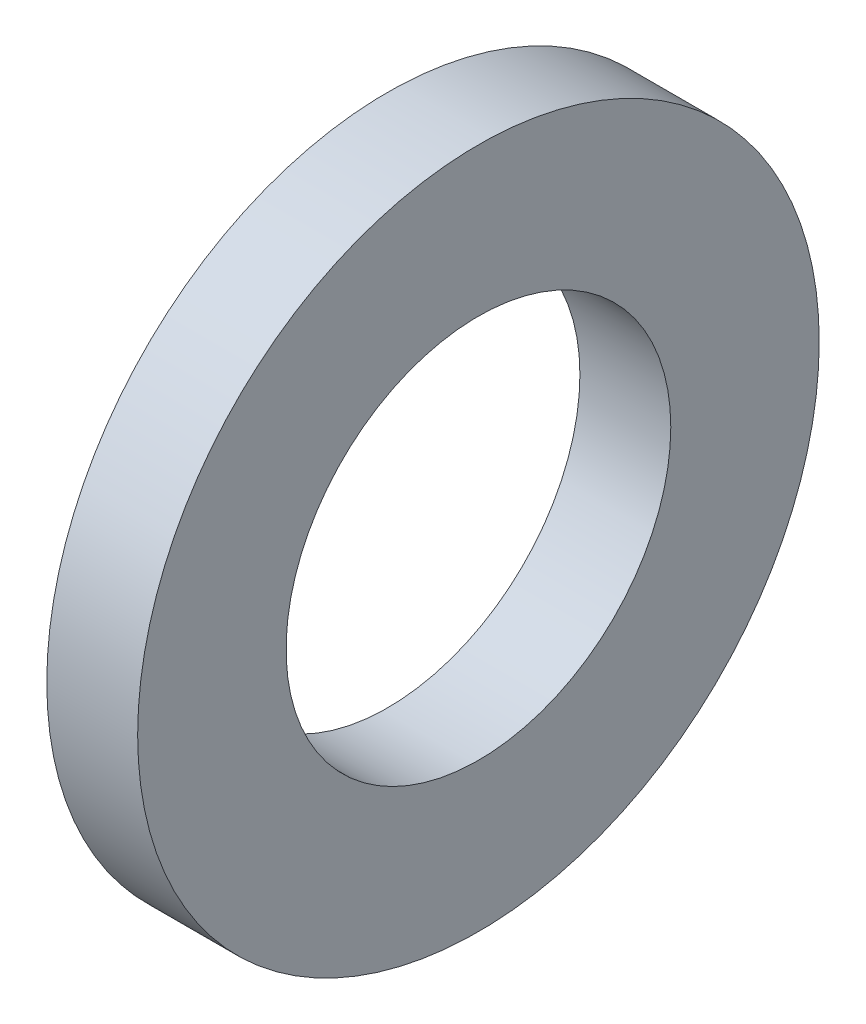
ISO-10303-21;
HEADER;
FILE_DESCRIPTION(('STEP AP214'),'2;1');
FILE_NAME('part.step','',(''),(''),'','','');
FILE_SCHEMA(('AUTOMOTIVE_DESIGN { 1 0 10303 214 1 1 1 1 }'));
ENDSEC;
DATA;
#1=APPLICATION_CONTEXT('core data for automotive mechanical design processes');
#2=APPLICATION_PROTOCOL_DEFINITION('international standard','automotive_design',2000,#1);
#3=PRODUCT_CONTEXT('',#1,'mechanical');
#4=PRODUCT('Part','Part','',(#3));
#5=PRODUCT_RELATED_PRODUCT_CATEGORY('part','',(#4));
#6=PRODUCT_DEFINITION_FORMATION('','',#4);
#7=PRODUCT_DEFINITION_CONTEXT('part definition',#1,'design');
#8=PRODUCT_DEFINITION('design','',#6,#7);
#9=PRODUCT_DEFINITION_SHAPE('','',#8);
#10=(LENGTH_UNIT() NAMED_UNIT(*) SI_UNIT(.MILLI.,.METRE.));
#11=(NAMED_UNIT(*) PLANE_ANGLE_UNIT() SI_UNIT($,.RADIAN.));
#12=(NAMED_UNIT(*) SI_UNIT($,.STERADIAN.) SOLID_ANGLE_UNIT());
#13=UNCERTAINTY_MEASURE_WITH_UNIT(LENGTH_MEASURE(1.E-05),#10,'distance_accuracy_value','');
#14=(GEOMETRIC_REPRESENTATION_CONTEXT(3) GLOBAL_UNCERTAINTY_ASSIGNED_CONTEXT((#13)) GLOBAL_UNIT_ASSIGNED_CONTEXT((#10,
#11,#12)) REPRESENTATION_CONTEXT('',''));
#15=CARTESIAN_POINT('',(0.,0.,0.));
#16=DIRECTION('',(0.,0.,1.));
#17=DIRECTION('',(1.,0.,0.));
#18=AXIS2_PLACEMENT_3D('',#15,#16,#17);
#19=CARTESIAN_POINT('',(0.,0.,0.));
#20=DIRECTION('',(1.,0.,0.));
#21=DIRECTION('',(0.,0.,1.));
#22=AXIS2_PLACEMENT_3D('',#19,#20,#21);
#23=PLANE('',#22);
#24=CARTESIAN_POINT('',(0.,0.,0.));
#25=DIRECTION('',(-1.,0.,0.));
#26=DIRECTION('',(0.,0.,1.));
#27=AXIS2_PLACEMENT_3D('',#24,#25,#26);
#28=CIRCLE('',#27,5.715);
#29=CARTESIAN_POINT('',(0.,0.,-5.715));
#30=VERTEX_POINT('',#29);
#31=EDGE_CURVE('E10',#30,#30,#28,.T.);
#32=ORIENTED_EDGE('',*,*,#31,.T.);
#33=EDGE_LOOP('',(#32));
#34=FACE_BOUND('',#33,.T.);
#35=CARTESIAN_POINT('',(0.,0.,0.));
#36=DIRECTION('',(-1.,0.,0.));
#37=DIRECTION('',(0.,0.,1.));
#38=AXIS2_PLACEMENT_3D('',#35,#36,#37);
#39=CIRCLE('',#38,3.2258);
#40=CARTESIAN_POINT('',(0.,0.,-3.2258));
#41=VERTEX_POINT('',#40);
#42=EDGE_CURVE('E48',#41,#41,#39,.T.);
#43=ORIENTED_EDGE('',*,*,#42,.F.);
#44=EDGE_LOOP('',(#43));
#45=FACE_BOUND('',#44,.T.);
#46=ADVANCED_FACE('F41',(#34,#45),#23,.F.);
#47=CARTESIAN_POINT('',(0.762,0.,0.));
#48=DIRECTION('',(-1.,0.,0.));
#49=DIRECTION('',(0.,0.,-1.));
#50=AXIS2_PLACEMENT_3D('',#47,#48,#49);
#51=CYLINDRICAL_SURFACE('',#50,5.715);
#52=CARTESIAN_POINT('',(1.524,0.,0.));
#53=DIRECTION('',(1.,0.,0.));
#54=DIRECTION('',(0.,0.,-1.));
#55=AXIS2_PLACEMENT_3D('',#52,#53,#54);
#56=CIRCLE('',#55,5.715);
#57=CARTESIAN_POINT('',(1.524,0.,-5.715));
#58=VERTEX_POINT('',#57);
#59=EDGE_CURVE('E52',#58,#58,#56,.T.);
#60=CARTESIAN_POINT('',(0.,0.,-5.715));
#61=CARTESIAN_POINT('',(0.015875,0.,-5.715));
#62=CARTESIAN_POINT('',(0.03175,0.,-5.715));
#63=CARTESIAN_POINT('',(0.0635,0.,-5.715));
#64=CARTESIAN_POINT('',(0.0793750000000001,0.,-5.715));
#65=CARTESIAN_POINT('',(0.111125,0.,-5.715));
#66=CARTESIAN_POINT('',(0.127,0.,-5.715));
#67=CARTESIAN_POINT('',(0.15875,0.,-5.715));
#68=CARTESIAN_POINT('',(0.174625,0.,-5.715));
#69=CARTESIAN_POINT('',(0.206375,0.,-5.715));
#70=CARTESIAN_POINT('',(0.22225,0.,-5.715));
#71=CARTESIAN_POINT('',(0.254,0.,-5.715));
#72=CARTESIAN_POINT('',(0.269875,0.,-5.715));
#73=CARTESIAN_POINT('',(0.301625,0.,-5.715));
#74=CARTESIAN_POINT('',(0.3175,0.,-5.715));
#75=CARTESIAN_POINT('',(0.34925,0.,-5.715));
#76=CARTESIAN_POINT('',(0.365125,0.,-5.715));
#77=CARTESIAN_POINT('',(0.396875,0.,-5.715));
#78=CARTESIAN_POINT('',(0.41275,0.,-5.715));
#79=CARTESIAN_POINT('',(0.4445,0.,-5.715));
#80=CARTESIAN_POINT('',(0.460375,0.,-5.715));
#81=CARTESIAN_POINT('',(0.492125,0.,-5.715));
#82=CARTESIAN_POINT('',(0.508,0.,-5.715));
#83=CARTESIAN_POINT('',(0.53975,0.,-5.715));
#84=CARTESIAN_POINT('',(0.555625,0.,-5.715));
#85=CARTESIAN_POINT('',(0.587375,0.,-5.715));
#86=CARTESIAN_POINT('',(0.60325,0.,-5.715));
#87=CARTESIAN_POINT('',(0.635,0.,-5.715));
#88=CARTESIAN_POINT('',(0.650875,0.,-5.715));
#89=CARTESIAN_POINT('',(0.682625,0.,-5.715));
#90=CARTESIAN_POINT('',(0.6985,0.,-5.715));
#91=CARTESIAN_POINT('',(0.73025,0.,-5.715));
#92=CARTESIAN_POINT('',(0.746125,0.,-5.715));
#93=CARTESIAN_POINT('',(0.777875,0.,-5.715));
#94=CARTESIAN_POINT('',(0.79375,0.,-5.715));
#95=CARTESIAN_POINT('',(0.8255,0.,-5.715));
#96=CARTESIAN_POINT('',(0.841375,0.,-5.715));
#97=CARTESIAN_POINT('',(0.873125,0.,-5.715));
#98=CARTESIAN_POINT('',(0.889,0.,-5.715));
#99=CARTESIAN_POINT('',(0.92075,0.,-5.715));
#100=CARTESIAN_POINT('',(0.936625,0.,-5.715));
#101=CARTESIAN_POINT('',(0.968375,0.,-5.715));
#102=CARTESIAN_POINT('',(0.98425,0.,-5.715));
#103=CARTESIAN_POINT('',(1.016,0.,-5.715));
#104=CARTESIAN_POINT('',(1.031875,0.,-5.715));
#105=CARTESIAN_POINT('',(1.063625,0.,-5.715));
#106=CARTESIAN_POINT('',(1.0795,0.,-5.715));
#107=CARTESIAN_POINT('',(1.11125,0.,-5.715));
#108=CARTESIAN_POINT('',(1.127125,0.,-5.715));
#109=CARTESIAN_POINT('',(1.158875,0.,-5.715));
#110=CARTESIAN_POINT('',(1.17475,0.,-5.715));
#111=CARTESIAN_POINT('',(1.2065,0.,-5.715));
#112=CARTESIAN_POINT('',(1.222375,0.,-5.715));
#113=CARTESIAN_POINT('',(1.254125,0.,-5.715));
#114=CARTESIAN_POINT('',(1.27,0.,-5.715));
#115=CARTESIAN_POINT('',(1.30175,0.,-5.715));
#116=CARTESIAN_POINT('',(1.317625,0.,-5.715));
#117=CARTESIAN_POINT('',(1.349375,0.,-5.715));
#118=CARTESIAN_POINT('',(1.36525,0.,-5.715));
#119=CARTESIAN_POINT('',(1.397,0.,-5.715));
#120=CARTESIAN_POINT('',(1.412875,0.,-5.715));
#121=CARTESIAN_POINT('',(1.444625,0.,-5.715));
#122=CARTESIAN_POINT('',(1.4605,0.,-5.715));
#123=CARTESIAN_POINT('',(1.49225,0.,-5.715));
#124=CARTESIAN_POINT('',(1.508125,0.,-5.715));
#125=CARTESIAN_POINT('',(1.524,0.,-5.715));
#126=B_SPLINE_CURVE_WITH_KNOTS('',3,(#60,#61,#62,#63,#64,#65,#66,#67,#68,#69,#70,#71,#72,#73,
#74,#75,#76,#77,#78,#79,#80,#81,#82,#83,#84,#85,#86,#87,#88,#89,#90,#91,#92,#93,#94,#95,#96,#97,
#98,#99,#100,#101,#102,#103,#104,#105,#106,#107,#108,#109,#110,#111,#112,#113,#114,#115,#116,
#117,#118,#119,#120,#121,#122,#123,#124,#125),.UNSPECIFIED.,.F.,.F.,(4,2,2,2,2,2,2,2,2,2,2,2,2,
2,2,2,2,2,2,2,2,2,2,2,2,2,2,2,2,2,2,2,4),(0.,0.047625,0.0952500000000001,0.142875,0.1905,
0.238125,0.28575,0.333375,0.381,0.428625,0.47625,0.523875,0.5715,0.619125,0.66675,0.714375,
0.762,0.809625,0.85725,0.904875,0.9525,1.000125,1.04775,1.095375,1.143,1.190625,1.23825,
1.285875,1.3335,1.381125,1.42875,1.476375,1.524),.UNSPECIFIED.);
#127=EDGE_CURVE('BSEAM43',#30,#58,#126,.T.);
#128=ORIENTED_EDGE('',*,*,#31,.F.);
#129=ORIENTED_EDGE('',*,*,#59,.F.);
#130=ORIENTED_EDGE('',*,*,#127,.T.);
#131=ORIENTED_EDGE('',*,*,#127,.F.);
#132=EDGE_LOOP('',(#128,#130,#129,#131));
#133=FACE_BOUND('',#132,.T.);
#134=ADVANCED_FACE('F43',(#133),#51,.T.);
#135=CARTESIAN_POINT('',(0.762,0.,0.));
#136=DIRECTION('',(-1.,0.,0.));
#137=DIRECTION('',(0.,0.,-1.));
#138=AXIS2_PLACEMENT_3D('',#135,#136,#137);
#139=CYLINDRICAL_SURFACE('',#138,3.2258);
#140=CARTESIAN_POINT('',(1.524,0.,0.));
#141=DIRECTION('',(1.,0.,0.));
#142=DIRECTION('',(0.,0.,-1.));
#143=AXIS2_PLACEMENT_3D('',#140,#141,#142);
#144=CIRCLE('',#143,3.2258);
#145=CARTESIAN_POINT('',(1.524,0.,-3.2258));
#146=VERTEX_POINT('',#145);
#147=EDGE_CURVE('E56',#146,#146,#144,.T.);
#148=CARTESIAN_POINT('',(0.,0.,-3.2258));
#149=CARTESIAN_POINT('',(0.015875,0.,-3.2258));
#150=CARTESIAN_POINT('',(0.03175,0.,-3.2258));
#151=CARTESIAN_POINT('',(0.0635,0.,-3.2258));
#152=CARTESIAN_POINT('',(0.0793750000000001,0.,-3.2258));
#153=CARTESIAN_POINT('',(0.111125,0.,-3.2258));
#154=CARTESIAN_POINT('',(0.127,0.,-3.2258));
#155=CARTESIAN_POINT('',(0.15875,0.,-3.2258));
#156=CARTESIAN_POINT('',(0.174625,0.,-3.2258));
#157=CARTESIAN_POINT('',(0.206375,0.,-3.2258));
#158=CARTESIAN_POINT('',(0.22225,0.,-3.2258));
#159=CARTESIAN_POINT('',(0.254,0.,-3.2258));
#160=CARTESIAN_POINT('',(0.269875,0.,-3.2258));
#161=CARTESIAN_POINT('',(0.301625,0.,-3.2258));
#162=CARTESIAN_POINT('',(0.3175,0.,-3.2258));
#163=CARTESIAN_POINT('',(0.34925,0.,-3.2258));
#164=CARTESIAN_POINT('',(0.365125,0.,-3.2258));
#165=CARTESIAN_POINT('',(0.396875,0.,-3.2258));
#166=CARTESIAN_POINT('',(0.41275,0.,-3.2258));
#167=CARTESIAN_POINT('',(0.4445,0.,-3.2258));
#168=CARTESIAN_POINT('',(0.460375,0.,-3.2258));
#169=CARTESIAN_POINT('',(0.492125,0.,-3.2258));
#170=CARTESIAN_POINT('',(0.508,0.,-3.2258));
#171=CARTESIAN_POINT('',(0.53975,0.,-3.2258));
#172=CARTESIAN_POINT('',(0.555625,0.,-3.2258));
#173=CARTESIAN_POINT('',(0.587375,0.,-3.2258));
#174=CARTESIAN_POINT('',(0.60325,0.,-3.2258));
#175=CARTESIAN_POINT('',(0.635,0.,-3.2258));
#176=CARTESIAN_POINT('',(0.650875,0.,-3.2258));
#177=CARTESIAN_POINT('',(0.682625,0.,-3.2258));
#178=CARTESIAN_POINT('',(0.6985,0.,-3.2258));
#179=CARTESIAN_POINT('',(0.73025,0.,-3.2258));
#180=CARTESIAN_POINT('',(0.746125,0.,-3.2258));
#181=CARTESIAN_POINT('',(0.777875,0.,-3.2258));
#182=CARTESIAN_POINT('',(0.79375,0.,-3.2258));
#183=CARTESIAN_POINT('',(0.8255,0.,-3.2258));
#184=CARTESIAN_POINT('',(0.841375,0.,-3.2258));
#185=CARTESIAN_POINT('',(0.873125,0.,-3.2258));
#186=CARTESIAN_POINT('',(0.889,0.,-3.2258));
#187=CARTESIAN_POINT('',(0.92075,0.,-3.2258));
#188=CARTESIAN_POINT('',(0.936625,0.,-3.2258));
#189=CARTESIAN_POINT('',(0.968375,0.,-3.2258));
#190=CARTESIAN_POINT('',(0.98425,0.,-3.2258));
#191=CARTESIAN_POINT('',(1.016,0.,-3.2258));
#192=CARTESIAN_POINT('',(1.031875,0.,-3.2258));
#193=CARTESIAN_POINT('',(1.063625,0.,-3.2258));
#194=CARTESIAN_POINT('',(1.0795,0.,-3.2258));
#195=CARTESIAN_POINT('',(1.11125,0.,-3.2258));
#196=CARTESIAN_POINT('',(1.127125,0.,-3.2258));
#197=CARTESIAN_POINT('',(1.158875,0.,-3.2258));
#198=CARTESIAN_POINT('',(1.17475,0.,-3.2258));
#199=CARTESIAN_POINT('',(1.2065,0.,-3.2258));
#200=CARTESIAN_POINT('',(1.222375,0.,-3.2258));
#201=CARTESIAN_POINT('',(1.254125,0.,-3.2258));
#202=CARTESIAN_POINT('',(1.27,0.,-3.2258));
#203=CARTESIAN_POINT('',(1.30175,0.,-3.2258));
#204=CARTESIAN_POINT('',(1.317625,0.,-3.2258));
#205=CARTESIAN_POINT('',(1.349375,0.,-3.2258));
#206=CARTESIAN_POINT('',(1.36525,0.,-3.2258));
#207=CARTESIAN_POINT('',(1.397,0.,-3.2258));
#208=CARTESIAN_POINT('',(1.412875,0.,-3.2258));
#209=CARTESIAN_POINT('',(1.444625,0.,-3.2258));
#210=CARTESIAN_POINT('',(1.4605,0.,-3.2258));
#211=CARTESIAN_POINT('',(1.49225,0.,-3.2258));
#212=CARTESIAN_POINT('',(1.508125,0.,-3.2258));
#213=CARTESIAN_POINT('',(1.524,0.,-3.2258));
#214=B_SPLINE_CURVE_WITH_KNOTS('',3,(#148,#149,#150,#151,#152,#153,#154,#155,#156,#157,#158,
#159,#160,#161,#162,#163,#164,#165,#166,#167,#168,#169,#170,#171,#172,#173,#174,#175,#176,#177,
#178,#179,#180,#181,#182,#183,#184,#185,#186,#187,#188,#189,#190,#191,#192,#193,#194,#195,#196,
#197,#198,#199,#200,#201,#202,#203,#204,#205,#206,#207,#208,#209,#210,#211,#212,#213),
.UNSPECIFIED.,.F.,.F.,(4,2,2,2,2,2,2,2,2,2,2,2,2,2,2,2,2,2,2,2,2,2,2,2,2,2,2,2,2,2,2,2,4),(0.,
0.047625,0.0952500000000001,0.142875,0.1905,0.238125,0.28575,0.333375,0.381,0.428625,0.47625,
0.523875,0.5715,0.619125,0.66675,0.714375,0.762,0.809625,0.85725,0.904875,0.9525,1.000125,
1.04775,1.095375,1.143,1.190625,1.23825,1.285875,1.3335,1.381125,1.42875,1.476375,1.524),.UNSPECIFIED.);
#215=EDGE_CURVE('BSEAM62',#41,#146,#214,.T.);
#216=ORIENTED_EDGE('',*,*,#42,.T.);
#217=ORIENTED_EDGE('',*,*,#147,.T.);
#218=ORIENTED_EDGE('',*,*,#215,.T.);
#219=ORIENTED_EDGE('',*,*,#215,.F.);
#220=EDGE_LOOP('',(#216,#218,#217,#219));
#221=FACE_BOUND('',#220,.T.);
#222=ADVANCED_FACE('F62',(#221),#139,.F.);
#223=CARTESIAN_POINT('',(1.524,0.,0.));
#224=DIRECTION('',(-1.,0.,0.));
#225=DIRECTION('',(0.,0.,-1.));
#226=AXIS2_PLACEMENT_3D('',#223,#224,#225);
#227=PLANE('',#226);
#228=ORIENTED_EDGE('',*,*,#147,.F.);
#229=EDGE_LOOP('',(#228));
#230=FACE_BOUND('',#229,.T.);
#231=ORIENTED_EDGE('',*,*,#59,.T.);
#232=EDGE_LOOP('',(#231));
#233=FACE_BOUND('',#232,.T.);
#234=ADVANCED_FACE('F64',(#230,#233),#227,.F.);
#235=CLOSED_SHELL('',(#46,#134,#222,#234));
#236=MANIFOLD_SOLID_BREP('B2',#235);
#237=ADVANCED_BREP_SHAPE_REPRESENTATION('',(#18,#236),#14);
#238=SHAPE_DEFINITION_REPRESENTATION(#9,#237);
ENDSEC;
END-ISO-10303-21;
